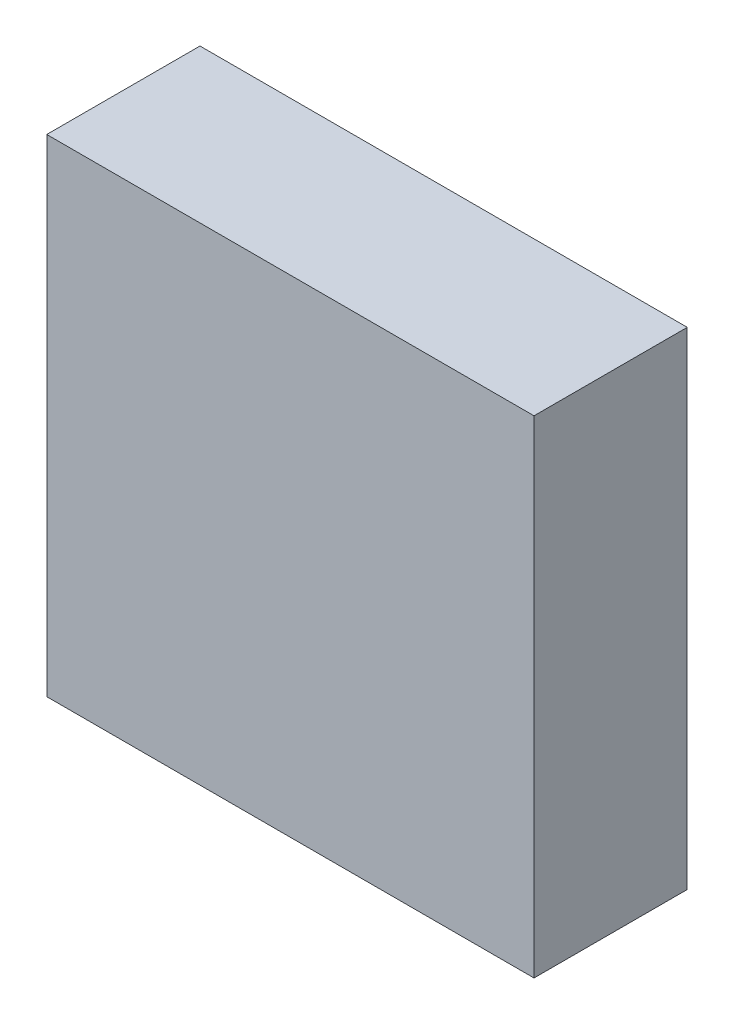
ISO-10303-21;
HEADER;
FILE_DESCRIPTION(('STEP AP214'),'2;1');
FILE_NAME('part.step','',(''),(''),'','','');
FILE_SCHEMA(('AUTOMOTIVE_DESIGN { 1 0 10303 214 1 1 1 1 }'));
ENDSEC;
DATA;
#1=APPLICATION_CONTEXT('core data for automotive mechanical design processes');
#2=APPLICATION_PROTOCOL_DEFINITION('international standard','automotive_design',2000,#1);
#3=PRODUCT_CONTEXT('',#1,'mechanical');
#4=PRODUCT('Part','Part','',(#3));
#5=PRODUCT_RELATED_PRODUCT_CATEGORY('part','',(#4));
#6=PRODUCT_DEFINITION_FORMATION('','',#4);
#7=PRODUCT_DEFINITION_CONTEXT('part definition',#1,'design');
#8=PRODUCT_DEFINITION('design','',#6,#7);
#9=PRODUCT_DEFINITION_SHAPE('','',#8);
#10=(LENGTH_UNIT() NAMED_UNIT(*) SI_UNIT(.MILLI.,.METRE.));
#11=(NAMED_UNIT(*) PLANE_ANGLE_UNIT() SI_UNIT($,.RADIAN.));
#12=(NAMED_UNIT(*) SI_UNIT($,.STERADIAN.) SOLID_ANGLE_UNIT());
#13=UNCERTAINTY_MEASURE_WITH_UNIT(LENGTH_MEASURE(1.E-05),#10,'distance_accuracy_value','');
#14=(GEOMETRIC_REPRESENTATION_CONTEXT(3) GLOBAL_UNCERTAINTY_ASSIGNED_CONTEXT((#13)) GLOBAL_UNIT_ASSIGNED_CONTEXT((#10,
#11,#12)) REPRESENTATION_CONTEXT('',''));
#15=CARTESIAN_POINT('',(0.,0.,0.));
#16=DIRECTION('',(0.,0.,1.));
#17=DIRECTION('',(1.,0.,0.));
#18=AXIS2_PLACEMENT_3D('',#15,#16,#17);
#19=CARTESIAN_POINT('',(-1.59,-1.5875,1.));
#20=DIRECTION('',(1.,0.,0.));
#21=DIRECTION('',(0.,0.,-1.));
#22=AXIS2_PLACEMENT_3D('',#19,#20,#21);
#23=PLANE('',#22);
#24=DIRECTION('',(0.,-1.,0.));
#25=VECTOR('',#24,1.);
#26=CARTESIAN_POINT('',(-1.59,-1.5875,0.));
#27=LINE('',#26,#25);
#28=CARTESIAN_POINT('',(-1.59,1.59,0.));
#29=VERTEX_POINT('',#28);
#30=CARTESIAN_POINT('',(-1.59,-1.5875,0.));
#31=VERTEX_POINT('',#30);
#32=EDGE_CURVE('E95',#29,#31,#27,.T.);
#33=ORIENTED_EDGE('',*,*,#32,.T.);
#34=DIRECTION('',(0.,0.,-1.));
#35=VECTOR('',#34,1.);
#36=CARTESIAN_POINT('',(-1.59,-1.5875,1.));
#37=LINE('',#36,#35);
#38=CARTESIAN_POINT('',(-1.59,-1.5875,1.));
#39=VERTEX_POINT('',#38);
#40=EDGE_CURVE('E11',#39,#31,#37,.T.);
#41=ORIENTED_EDGE('',*,*,#40,.F.);
#42=DIRECTION('',(0.,-1.,0.));
#43=VECTOR('',#42,1.);
#44=CARTESIAN_POINT('',(-1.59,-1.5875,1.));
#45=LINE('',#44,#43);
#46=CARTESIAN_POINT('',(-1.59,1.59,1.));
#47=VERTEX_POINT('',#46);
#48=EDGE_CURVE('E83',#47,#39,#45,.T.);
#49=ORIENTED_EDGE('',*,*,#48,.F.);
#50=DIRECTION('',(0.,0.,-1.));
#51=VECTOR('',#50,1.);
#52=CARTESIAN_POINT('',(-1.59,1.59,1.));
#53=LINE('',#52,#51);
#54=EDGE_CURVE('E91',#47,#29,#53,.T.);
#55=ORIENTED_EDGE('',*,*,#54,.T.);
#56=EDGE_LOOP('',(#33,#41,#49,#55));
#57=FACE_BOUND('',#56,.T.);
#58=ADVANCED_FACE('F32',(#57),#23,.F.);
#59=CARTESIAN_POINT('',(1.59,-1.5875,1.));
#60=DIRECTION('',(0.,1.,0.));
#61=DIRECTION('',(0.,0.,1.));
#62=AXIS2_PLACEMENT_3D('',#59,#60,#61);
#63=PLANE('',#62);
#64=DIRECTION('',(1.,0.,0.));
#65=VECTOR('',#64,1.);
#66=CARTESIAN_POINT('',(1.59,-1.5875,0.));
#67=LINE('',#66,#65);
#68=CARTESIAN_POINT('',(1.59,-1.5875,0.));
#69=VERTEX_POINT('',#68);
#70=EDGE_CURVE('E87',#31,#69,#67,.T.);
#71=ORIENTED_EDGE('',*,*,#70,.T.);
#72=DIRECTION('',(0.,0.,-1.));
#73=VECTOR('',#72,1.);
#74=CARTESIAN_POINT('',(1.59,-1.5875,1.));
#75=LINE('',#74,#73);
#76=CARTESIAN_POINT('',(1.59,-1.5875,1.));
#77=VERTEX_POINT('',#76);
#78=EDGE_CURVE('E40',#77,#69,#75,.T.);
#79=ORIENTED_EDGE('',*,*,#78,.F.);
#80=DIRECTION('',(1.,0.,0.));
#81=VECTOR('',#80,1.);
#82=CARTESIAN_POINT('',(1.59,-1.5875,1.));
#83=LINE('',#82,#81);
#84=EDGE_CURVE('E78',#39,#77,#83,.T.);
#85=ORIENTED_EDGE('',*,*,#84,.F.);
#86=ORIENTED_EDGE('',*,*,#40,.T.);
#87=EDGE_LOOP('',(#71,#79,#85,#86));
#88=FACE_BOUND('',#87,.T.);
#89=ADVANCED_FACE('F86',(#88),#63,.F.);
#90=CARTESIAN_POINT('',(1.59,1.59,1.));
#91=DIRECTION('',(-1.,0.,0.));
#92=DIRECTION('',(0.,0.,1.));
#93=AXIS2_PLACEMENT_3D('',#90,#91,#92);
#94=PLANE('',#93);
#95=DIRECTION('',(0.,1.,0.));
#96=VECTOR('',#95,1.);
#97=CARTESIAN_POINT('',(1.59,1.59,0.));
#98=LINE('',#97,#96);
#99=CARTESIAN_POINT('',(1.59,1.59,0.));
#100=VERTEX_POINT('',#99);
#101=EDGE_CURVE('E65',#69,#100,#98,.T.);
#102=ORIENTED_EDGE('',*,*,#101,.T.);
#103=DIRECTION('',(0.,0.,-1.));
#104=VECTOR('',#103,1.);
#105=CARTESIAN_POINT('',(1.59,1.59,1.));
#106=LINE('',#105,#104);
#107=CARTESIAN_POINT('',(1.59,1.59,1.));
#108=VERTEX_POINT('',#107);
#109=EDGE_CURVE('E88',#108,#100,#106,.T.);
#110=ORIENTED_EDGE('',*,*,#109,.F.);
#111=DIRECTION('',(0.,1.,0.));
#112=VECTOR('',#111,1.);
#113=CARTESIAN_POINT('',(1.59,1.59,1.));
#114=LINE('',#113,#112);
#115=EDGE_CURVE('E81',#77,#108,#114,.T.);
#116=ORIENTED_EDGE('',*,*,#115,.F.);
#117=ORIENTED_EDGE('',*,*,#78,.T.);
#118=EDGE_LOOP('',(#102,#110,#116,#117));
#119=FACE_BOUND('',#118,.T.);
#120=ADVANCED_FACE('F89',(#119),#94,.F.);
#121=CARTESIAN_POINT('',(-1.59,1.59,1.));
#122=DIRECTION('',(0.,-1.,0.));
#123=DIRECTION('',(0.,0.,-1.));
#124=AXIS2_PLACEMENT_3D('',#121,#122,#123);
#125=PLANE('',#124);
#126=DIRECTION('',(-1.,0.,0.));
#127=VECTOR('',#126,1.);
#128=CARTESIAN_POINT('',(-1.59,1.59,0.));
#129=LINE('',#128,#127);
#130=EDGE_CURVE('E71',#100,#29,#129,.T.);
#131=ORIENTED_EDGE('',*,*,#130,.T.);
#132=ORIENTED_EDGE('',*,*,#54,.F.);
#133=DIRECTION('',(-1.,0.,0.));
#134=VECTOR('',#133,1.);
#135=CARTESIAN_POINT('',(-1.59,1.59,1.));
#136=LINE('',#135,#134);
#137=EDGE_CURVE('E48',#108,#47,#136,.T.);
#138=ORIENTED_EDGE('',*,*,#137,.F.);
#139=ORIENTED_EDGE('',*,*,#109,.T.);
#140=EDGE_LOOP('',(#131,#132,#138,#139));
#141=FACE_BOUND('',#140,.T.);
#142=ADVANCED_FACE('F102',(#141),#125,.F.);
#143=CARTESIAN_POINT('',(0.,0.,1.));
#144=DIRECTION('',(0.,0.,-1.));
#145=DIRECTION('',(-1.,0.,0.));
#146=AXIS2_PLACEMENT_3D('',#143,#144,#145);
#147=PLANE('',#146);
#148=ORIENTED_EDGE('',*,*,#48,.T.);
#149=ORIENTED_EDGE('',*,*,#84,.T.);
#150=ORIENTED_EDGE('',*,*,#115,.T.);
#151=ORIENTED_EDGE('',*,*,#137,.T.);
#152=EDGE_LOOP('',(#148,#149,#150,#151));
#153=FACE_BOUND('',#152,.T.);
#154=ADVANCED_FACE('F79',(#153),#147,.F.);
#155=CARTESIAN_POINT('',(0.,0.,0.));
#156=DIRECTION('',(0.,0.,-1.));
#157=DIRECTION('',(-1.,0.,0.));
#158=AXIS2_PLACEMENT_3D('',#155,#156,#157);
#159=PLANE('',#158);
#160=ORIENTED_EDGE('',*,*,#32,.F.);
#161=ORIENTED_EDGE('',*,*,#130,.F.);
#162=ORIENTED_EDGE('',*,*,#101,.F.);
#163=ORIENTED_EDGE('',*,*,#70,.F.);
#164=EDGE_LOOP('',(#160,#161,#162,#163));
#165=FACE_BOUND('',#164,.T.);
#166=ADVANCED_FACE('F105',(#165),#159,.T.);
#167=CLOSED_SHELL('',(#58,#89,#120,#142,#154,#166));
#168=MANIFOLD_SOLID_BREP('B2',#167);
#169=ADVANCED_BREP_SHAPE_REPRESENTATION('',(#18,#168),#14);
#170=SHAPE_DEFINITION_REPRESENTATION(#9,#169);
ENDSEC;
END-ISO-10303-21;
